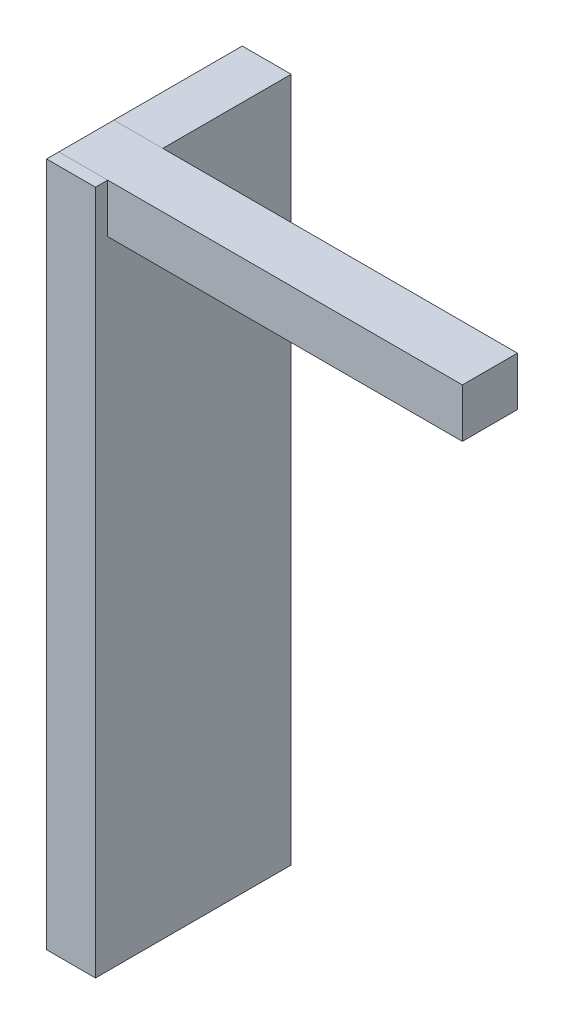
ISO-10303-21;
HEADER;
FILE_DESCRIPTION(('STEP AP214'),'2;1');
FILE_NAME('part.step','',(''),(''),'','','');
FILE_SCHEMA(('AUTOMOTIVE_DESIGN { 1 0 10303 214 1 1 1 1 }'));
ENDSEC;
DATA;
#1=APPLICATION_CONTEXT('core data for automotive mechanical design processes');
#2=APPLICATION_PROTOCOL_DEFINITION('international standard','automotive_design',2000,#1);
#3=PRODUCT_CONTEXT('',#1,'mechanical');
#4=PRODUCT('Part','Part','',(#3));
#5=PRODUCT_RELATED_PRODUCT_CATEGORY('part','',(#4));
#6=PRODUCT_DEFINITION_FORMATION('','',#4);
#7=PRODUCT_DEFINITION_CONTEXT('part definition',#1,'design');
#8=PRODUCT_DEFINITION('design','',#6,#7);
#9=PRODUCT_DEFINITION_SHAPE('','',#8);
#10=(LENGTH_UNIT() NAMED_UNIT(*) SI_UNIT(.MILLI.,.METRE.));
#11=(NAMED_UNIT(*) PLANE_ANGLE_UNIT() SI_UNIT($,.RADIAN.));
#12=(NAMED_UNIT(*) SI_UNIT($,.STERADIAN.) SOLID_ANGLE_UNIT());
#13=UNCERTAINTY_MEASURE_WITH_UNIT(LENGTH_MEASURE(1.E-05),#10,'distance_accuracy_value','');
#14=(GEOMETRIC_REPRESENTATION_CONTEXT(3) GLOBAL_UNCERTAINTY_ASSIGNED_CONTEXT((#13)) GLOBAL_UNIT_ASSIGNED_CONTEXT((#10,
#11,#12)) REPRESENTATION_CONTEXT('',''));
#15=CARTESIAN_POINT('',(0.,0.,0.));
#16=DIRECTION('',(0.,0.,1.));
#17=DIRECTION('',(1.,0.,0.));
#18=AXIS2_PLACEMENT_3D('',#15,#16,#17);
#19=CARTESIAN_POINT('',(79.,244.,39.));
#20=DIRECTION('',(0.,0.,-1.));
#21=DIRECTION('',(-1.,0.,0.));
#22=AXIS2_PLACEMENT_3D('',#19,#20,#21);
#23=PLANE('',#22);
#24=DIRECTION('',(0.,-1.,0.));
#25=VECTOR('',#24,1.);
#26=CARTESIAN_POINT('',(46.,244.,39.));
#27=LINE('',#26,#25);
#28=CARTESIAN_POINT('',(46.,248.,39.));
#29=VERTEX_POINT('',#28);
#30=CARTESIAN_POINT('',(46.,244.,39.));
#31=VERTEX_POINT('',#30);
#32=EDGE_CURVE('E112',#29,#31,#27,.T.);
#33=ORIENTED_EDGE('',*,*,#32,.T.);
#34=DIRECTION('',(-1.,0.,0.));
#35=VECTOR('',#34,1.);
#36=CARTESIAN_POINT('',(79.,244.,39.));
#37=LINE('',#36,#35);
#38=CARTESIAN_POINT('',(79.,244.,39.));
#39=VERTEX_POINT('',#38);
#40=EDGE_CURVE('E12',#39,#31,#37,.T.);
#41=ORIENTED_EDGE('',*,*,#40,.F.);
#42=DIRECTION('',(0.,-1.,0.));
#43=VECTOR('',#42,1.);
#44=CARTESIAN_POINT('',(79.,244.,39.));
#45=LINE('',#44,#43);
#46=CARTESIAN_POINT('',(79.,248.,39.));
#47=VERTEX_POINT('',#46);
#48=EDGE_CURVE('E100',#47,#39,#45,.T.);
#49=ORIENTED_EDGE('',*,*,#48,.F.);
#50=DIRECTION('',(-1.,0.,0.));
#51=VECTOR('',#50,1.);
#52=CARTESIAN_POINT('',(79.,248.,39.));
#53=LINE('',#52,#51);
#54=EDGE_CURVE('E108',#47,#29,#53,.T.);
#55=ORIENTED_EDGE('',*,*,#54,.T.);
#56=EDGE_LOOP('',(#33,#41,#49,#55));
#57=FACE_BOUND('',#56,.T.);
#58=ADVANCED_FACE('F49',(#57),#23,.F.);
#59=CARTESIAN_POINT('',(79.,244.,34.5));
#60=DIRECTION('',(0.,1.,0.));
#61=DIRECTION('',(0.,0.,1.));
#62=AXIS2_PLACEMENT_3D('',#59,#60,#61);
#63=PLANE('',#62);
#64=DIRECTION('',(0.,0.,-1.));
#65=VECTOR('',#64,1.);
#66=CARTESIAN_POINT('',(46.,244.,34.5));
#67=LINE('',#66,#65);
#68=CARTESIAN_POINT('',(46.,244.,34.5));
#69=VERTEX_POINT('',#68);
#70=EDGE_CURVE('E104',#31,#69,#67,.T.);
#71=ORIENTED_EDGE('',*,*,#70,.T.);
#72=DIRECTION('',(-1.,0.,0.));
#73=VECTOR('',#72,1.);
#74=CARTESIAN_POINT('',(79.,244.,34.5));
#75=LINE('',#74,#73);
#76=CARTESIAN_POINT('',(79.,244.,34.5));
#77=VERTEX_POINT('',#76);
#78=EDGE_CURVE('E57',#77,#69,#75,.T.);
#79=ORIENTED_EDGE('',*,*,#78,.F.);
#80=DIRECTION('',(0.,0.,-1.));
#81=VECTOR('',#80,1.);
#82=CARTESIAN_POINT('',(79.,244.,34.5));
#83=LINE('',#82,#81);
#84=EDGE_CURVE('E95',#39,#77,#83,.T.);
#85=ORIENTED_EDGE('',*,*,#84,.F.);
#86=ORIENTED_EDGE('',*,*,#40,.T.);
#87=EDGE_LOOP('',(#71,#79,#85,#86));
#88=FACE_BOUND('',#87,.T.);
#89=ADVANCED_FACE('F103',(#88),#63,.F.);
#90=CARTESIAN_POINT('',(79.,244.,34.5));
#91=DIRECTION('',(0.,0.,1.));
#92=DIRECTION('',(1.,0.,0.));
#93=AXIS2_PLACEMENT_3D('',#90,#91,#92);
#94=PLANE('',#93);
#95=DIRECTION('',(0.,1.,0.));
#96=VECTOR('',#95,1.);
#97=CARTESIAN_POINT('',(46.,244.,34.5));
#98=LINE('',#97,#96);
#99=CARTESIAN_POINT('',(46.,248.,34.5));
#100=VERTEX_POINT('',#99);
#101=EDGE_CURVE('E82',#69,#100,#98,.T.);
#102=ORIENTED_EDGE('',*,*,#101,.T.);
#103=DIRECTION('',(-1.,0.,0.));
#104=VECTOR('',#103,1.);
#105=CARTESIAN_POINT('',(79.,248.,34.5));
#106=LINE('',#105,#104);
#107=CARTESIAN_POINT('',(79.,248.,34.5));
#108=VERTEX_POINT('',#107);
#109=EDGE_CURVE('E105',#108,#100,#106,.T.);
#110=ORIENTED_EDGE('',*,*,#109,.F.);
#111=DIRECTION('',(0.,1.,0.));
#112=VECTOR('',#111,1.);
#113=CARTESIAN_POINT('',(79.,244.,34.5));
#114=LINE('',#113,#112);
#115=EDGE_CURVE('E98',#77,#108,#114,.T.);
#116=ORIENTED_EDGE('',*,*,#115,.F.);
#117=ORIENTED_EDGE('',*,*,#78,.T.);
#118=EDGE_LOOP('',(#102,#110,#116,#117));
#119=FACE_BOUND('',#118,.T.);
#120=ADVANCED_FACE('F106',(#119),#94,.F.);
#121=CARTESIAN_POINT('',(79.,248.,34.5));
#122=DIRECTION('',(0.,-1.,0.));
#123=DIRECTION('',(0.,0.,-1.));
#124=AXIS2_PLACEMENT_3D('',#121,#122,#123);
#125=PLANE('',#124);
#126=DIRECTION('',(0.,0.,1.));
#127=VECTOR('',#126,1.);
#128=CARTESIAN_POINT('',(46.,248.,34.5));
#129=LINE('',#128,#127);
#130=EDGE_CURVE('E88',#100,#29,#129,.T.);
#131=ORIENTED_EDGE('',*,*,#130,.T.);
#132=ORIENTED_EDGE('',*,*,#54,.F.);
#133=DIRECTION('',(0.,0.,1.));
#134=VECTOR('',#133,1.);
#135=CARTESIAN_POINT('',(79.,248.,34.5));
#136=LINE('',#135,#134);
#137=EDGE_CURVE('E65',#108,#47,#136,.T.);
#138=ORIENTED_EDGE('',*,*,#137,.F.);
#139=ORIENTED_EDGE('',*,*,#109,.T.);
#140=EDGE_LOOP('',(#131,#132,#138,#139));
#141=FACE_BOUND('',#140,.T.);
#142=ADVANCED_FACE('F119',(#141),#125,.F.);
#143=CARTESIAN_POINT('',(79.,0.,0.));
#144=DIRECTION('',(1.,0.,0.));
#145=DIRECTION('',(0.,0.,-1.));
#146=AXIS2_PLACEMENT_3D('',#143,#144,#145);
#147=PLANE('',#146);
#148=ORIENTED_EDGE('',*,*,#48,.T.);
#149=ORIENTED_EDGE('',*,*,#84,.T.);
#150=ORIENTED_EDGE('',*,*,#115,.T.);
#151=ORIENTED_EDGE('',*,*,#137,.T.);
#152=EDGE_LOOP('',(#148,#149,#150,#151));
#153=FACE_BOUND('',#152,.T.);
#154=ADVANCED_FACE('F96',(#153),#147,.T.);
#155=CARTESIAN_POINT('',(46.,0.,0.));
#156=DIRECTION('',(1.,0.,0.));
#157=DIRECTION('',(0.,0.,-1.));
#158=AXIS2_PLACEMENT_3D('',#155,#156,#157);
#159=PLANE('',#158);
#160=ORIENTED_EDGE('',*,*,#32,.F.);
#161=ORIENTED_EDGE('',*,*,#130,.F.);
#162=ORIENTED_EDGE('',*,*,#101,.F.);
#163=ORIENTED_EDGE('',*,*,#70,.F.);
#164=EDGE_LOOP('',(#160,#161,#162,#163));
#165=FACE_BOUND('',#164,.T.);
#166=ADVANCED_FACE('F122',(#165),#159,.F.);
#167=CLOSED_SHELL('',(#58,#89,#120,#142,#154,#166));
#168=MANIFOLD_SOLID_BREP('B2',#167);
#169=CARTESIAN_POINT('',(50.,192.,40.));
#170=DIRECTION('',(0.,0.,-1.));
#171=DIRECTION('',(-1.,0.,0.));
#172=AXIS2_PLACEMENT_3D('',#169,#170,#171);
#173=PLANE('',#172);
#174=DIRECTION('',(0.,-1.,0.));
#175=VECTOR('',#174,1.);
#176=CARTESIAN_POINT('',(46.,192.,40.));
#177=LINE('',#176,#175);
#178=CARTESIAN_POINT('',(46.,248.,40.));
#179=VERTEX_POINT('',#178);
#180=CARTESIAN_POINT('',(46.,192.,40.));
#181=VERTEX_POINT('',#180);
#182=EDGE_CURVE('E236',#179,#181,#177,.T.);
#183=ORIENTED_EDGE('',*,*,#182,.T.);
#184=DIRECTION('',(-1.,0.,0.));
#185=VECTOR('',#184,1.);
#186=CARTESIAN_POINT('',(50.,192.,40.));
#187=LINE('',#186,#185);
#188=CARTESIAN_POINT('',(50.,192.,40.));
#189=VERTEX_POINT('',#188);
#190=EDGE_CURVE('E47',#189,#181,#187,.T.);
#191=ORIENTED_EDGE('',*,*,#190,.F.);
#192=DIRECTION('',(0.,-1.,0.));
#193=VECTOR('',#192,1.);
#194=CARTESIAN_POINT('',(50.,192.,40.));
#195=LINE('',#194,#193);
#196=CARTESIAN_POINT('',(50.,248.,40.));
#197=VERTEX_POINT('',#196);
#198=EDGE_CURVE('E224',#197,#189,#195,.T.);
#199=ORIENTED_EDGE('',*,*,#198,.F.);
#200=DIRECTION('',(-1.,0.,0.));
#201=VECTOR('',#200,1.);
#202=CARTESIAN_POINT('',(50.,248.,40.));
#203=LINE('',#202,#201);
#204=EDGE_CURVE('E232',#197,#179,#203,.T.);
#205=ORIENTED_EDGE('',*,*,#204,.T.);
#206=EDGE_LOOP('',(#183,#191,#199,#205));
#207=FACE_BOUND('',#206,.T.);
#208=ADVANCED_FACE('F173',(#207),#173,.F.);
#209=CARTESIAN_POINT('',(50.,192.,24.));
#210=DIRECTION('',(0.,1.,0.));
#211=DIRECTION('',(0.,0.,1.));
#212=AXIS2_PLACEMENT_3D('',#209,#210,#211);
#213=PLANE('',#212);
#214=DIRECTION('',(0.,0.,-1.));
#215=VECTOR('',#214,1.);
#216=CARTESIAN_POINT('',(46.,192.,24.));
#217=LINE('',#216,#215);
#218=CARTESIAN_POINT('',(46.,192.,24.));
#219=VERTEX_POINT('',#218);
#220=EDGE_CURVE('E228',#181,#219,#217,.T.);
#221=ORIENTED_EDGE('',*,*,#220,.T.);
#222=DIRECTION('',(-1.,0.,0.));
#223=VECTOR('',#222,1.);
#224=CARTESIAN_POINT('',(50.,192.,24.));
#225=LINE('',#224,#223);
#226=CARTESIAN_POINT('',(50.,192.,24.));
#227=VERTEX_POINT('',#226);
#228=EDGE_CURVE('E181',#227,#219,#225,.T.);
#229=ORIENTED_EDGE('',*,*,#228,.F.);
#230=DIRECTION('',(0.,0.,-1.));
#231=VECTOR('',#230,1.);
#232=CARTESIAN_POINT('',(50.,192.,24.));
#233=LINE('',#232,#231);
#234=EDGE_CURVE('E219',#189,#227,#233,.T.);
#235=ORIENTED_EDGE('',*,*,#234,.F.);
#236=ORIENTED_EDGE('',*,*,#190,.T.);
#237=EDGE_LOOP('',(#221,#229,#235,#236));
#238=FACE_BOUND('',#237,.T.);
#239=ADVANCED_FACE('F227',(#238),#213,.F.);
#240=CARTESIAN_POINT('',(50.,192.,24.));
#241=DIRECTION('',(0.,0.,1.));
#242=DIRECTION('',(1.,0.,0.));
#243=AXIS2_PLACEMENT_3D('',#240,#241,#242);
#244=PLANE('',#243);
#245=DIRECTION('',(0.,1.,0.));
#246=VECTOR('',#245,1.);
#247=CARTESIAN_POINT('',(46.,192.,24.));
#248=LINE('',#247,#246);
#249=CARTESIAN_POINT('',(46.,248.,24.));
#250=VERTEX_POINT('',#249);
#251=EDGE_CURVE('E206',#219,#250,#248,.T.);
#252=ORIENTED_EDGE('',*,*,#251,.T.);
#253=DIRECTION('',(-1.,0.,0.));
#254=VECTOR('',#253,1.);
#255=CARTESIAN_POINT('',(50.,248.,24.));
#256=LINE('',#255,#254);
#257=CARTESIAN_POINT('',(50.,248.,24.));
#258=VERTEX_POINT('',#257);
#259=EDGE_CURVE('E229',#258,#250,#256,.T.);
#260=ORIENTED_EDGE('',*,*,#259,.F.);
#261=DIRECTION('',(0.,1.,0.));
#262=VECTOR('',#261,1.);
#263=CARTESIAN_POINT('',(50.,192.,24.));
#264=LINE('',#263,#262);
#265=EDGE_CURVE('E222',#227,#258,#264,.T.);
#266=ORIENTED_EDGE('',*,*,#265,.F.);
#267=ORIENTED_EDGE('',*,*,#228,.T.);
#268=EDGE_LOOP('',(#252,#260,#266,#267));
#269=FACE_BOUND('',#268,.T.);
#270=ADVANCED_FACE('F230',(#269),#244,.F.);
#271=CARTESIAN_POINT('',(50.,248.,24.));
#272=DIRECTION('',(0.,-1.,0.));
#273=DIRECTION('',(0.,0.,-1.));
#274=AXIS2_PLACEMENT_3D('',#271,#272,#273);
#275=PLANE('',#274);
#276=DIRECTION('',(0.,0.,1.));
#277=VECTOR('',#276,1.);
#278=CARTESIAN_POINT('',(46.,248.,24.));
#279=LINE('',#278,#277);
#280=EDGE_CURVE('E212',#250,#179,#279,.T.);
#281=ORIENTED_EDGE('',*,*,#280,.T.);
#282=ORIENTED_EDGE('',*,*,#204,.F.);
#283=DIRECTION('',(0.,0.,1.));
#284=VECTOR('',#283,1.);
#285=CARTESIAN_POINT('',(50.,248.,24.));
#286=LINE('',#285,#284);
#287=EDGE_CURVE('E189',#258,#197,#286,.T.);
#288=ORIENTED_EDGE('',*,*,#287,.F.);
#289=ORIENTED_EDGE('',*,*,#259,.T.);
#290=EDGE_LOOP('',(#281,#282,#288,#289));
#291=FACE_BOUND('',#290,.T.);
#292=ADVANCED_FACE('F243',(#291),#275,.F.);
#293=CARTESIAN_POINT('',(50.,0.,0.));
#294=DIRECTION('',(1.,0.,0.));
#295=DIRECTION('',(0.,0.,-1.));
#296=AXIS2_PLACEMENT_3D('',#293,#294,#295);
#297=PLANE('',#296);
#298=ORIENTED_EDGE('',*,*,#198,.T.);
#299=ORIENTED_EDGE('',*,*,#234,.T.);
#300=ORIENTED_EDGE('',*,*,#265,.T.);
#301=ORIENTED_EDGE('',*,*,#287,.T.);
#302=EDGE_LOOP('',(#298,#299,#300,#301));
#303=FACE_BOUND('',#302,.T.);
#304=ADVANCED_FACE('F220',(#303),#297,.T.);
#305=CARTESIAN_POINT('',(46.,0.,0.));
#306=DIRECTION('',(1.,0.,0.));
#307=DIRECTION('',(0.,0.,-1.));
#308=AXIS2_PLACEMENT_3D('',#305,#306,#307);
#309=PLANE('',#308);
#310=ORIENTED_EDGE('',*,*,#182,.F.);
#311=ORIENTED_EDGE('',*,*,#280,.F.);
#312=ORIENTED_EDGE('',*,*,#251,.F.);
#313=ORIENTED_EDGE('',*,*,#220,.F.);
#314=EDGE_LOOP('',(#310,#311,#312,#313));
#315=FACE_BOUND('',#314,.T.);
#316=ADVANCED_FACE('F246',(#315),#309,.F.);
#317=CLOSED_SHELL('',(#208,#239,#270,#292,#304,#316));
#318=MANIFOLD_SOLID_BREP('B6',#317);
#319=ADVANCED_BREP_SHAPE_REPRESENTATION('',(#18,#168,#318),#14);
#320=SHAPE_DEFINITION_REPRESENTATION(#9,#319);
ENDSEC;
END-ISO-10303-21;
